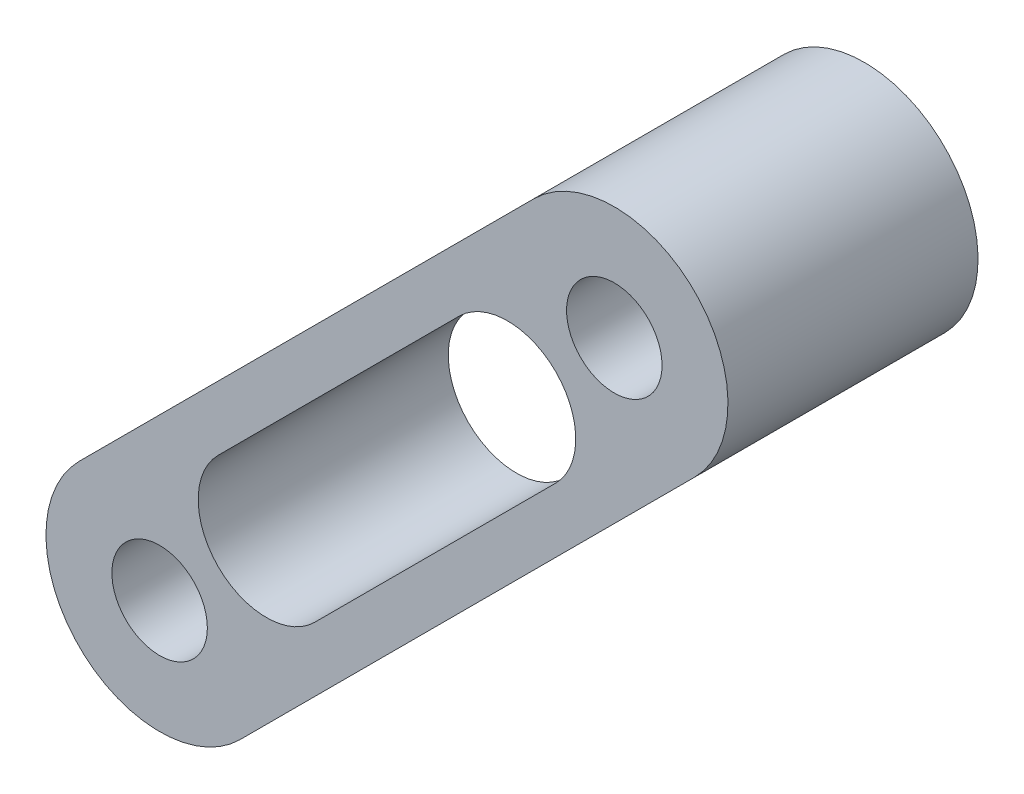
ISO-10303-21;
HEADER;
FILE_DESCRIPTION(('STEP AP214'),'2;1');
FILE_NAME('part.step','',(''),(''),'','','');
FILE_SCHEMA(('AUTOMOTIVE_DESIGN { 1 0 10303 214 1 1 1 1 }'));
ENDSEC;
DATA;
#1=APPLICATION_CONTEXT('core data for automotive mechanical design processes');
#2=APPLICATION_PROTOCOL_DEFINITION('international standard','automotive_design',2000,#1);
#3=PRODUCT_CONTEXT('',#1,'mechanical');
#4=PRODUCT('Part','Part','',(#3));
#5=PRODUCT_RELATED_PRODUCT_CATEGORY('part','',(#4));
#6=PRODUCT_DEFINITION_FORMATION('','',#4);
#7=PRODUCT_DEFINITION_CONTEXT('part definition',#1,'design');
#8=PRODUCT_DEFINITION('design','',#6,#7);
#9=PRODUCT_DEFINITION_SHAPE('','',#8);
#10=(LENGTH_UNIT() NAMED_UNIT(*) SI_UNIT(.MILLI.,.METRE.));
#11=(NAMED_UNIT(*) PLANE_ANGLE_UNIT() SI_UNIT($,.RADIAN.));
#12=(NAMED_UNIT(*) SI_UNIT($,.STERADIAN.) SOLID_ANGLE_UNIT());
#13=UNCERTAINTY_MEASURE_WITH_UNIT(LENGTH_MEASURE(1.E-05),#10,'distance_accuracy_value','');
#14=(GEOMETRIC_REPRESENTATION_CONTEXT(3) GLOBAL_UNCERTAINTY_ASSIGNED_CONTEXT((#13)) GLOBAL_UNIT_ASSIGNED_CONTEXT((#10,
#11,#12)) REPRESENTATION_CONTEXT('',''));
#15=CARTESIAN_POINT('',(0.,0.,0.));
#16=DIRECTION('',(0.,0.,1.));
#17=DIRECTION('',(1.,0.,0.));
#18=AXIS2_PLACEMENT_3D('',#15,#16,#17);
#19=CARTESIAN_POINT('',(-20.,0.,11.));
#20=DIRECTION('',(0.,0.,1.));
#21=DIRECTION('',(1.,0.,0.));
#22=AXIS2_PLACEMENT_3D('',#19,#20,#21);
#23=PLANE('',#22);
#24=CARTESIAN_POINT('',(-20.,0.,11.));
#25=DIRECTION('',(0.,0.,1.));
#26=DIRECTION('',(1.,0.,0.));
#27=AXIS2_PLACEMENT_3D('',#24,#25,#26);
#28=CIRCLE('',#27,2.1);
#29=CARTESIAN_POINT('',(-17.9,0.,11.));
#30=VERTEX_POINT('',#29);
#31=EDGE_CURVE('E140',#30,#30,#28,.T.);
#32=ORIENTED_EDGE('',*,*,#31,.F.);
#33=EDGE_LOOP('',(#32));
#34=FACE_BOUND('',#33,.T.);
#35=CARTESIAN_POINT('',(-20.,0.,11.));
#36=DIRECTION('',(0.,0.,1.));
#37=DIRECTION('',(1.,0.,0.));
#38=AXIS2_PLACEMENT_3D('',#35,#36,#37);
#39=CIRCLE('',#38,5.);
#40=CARTESIAN_POINT('',(-23.5355339059327,3.53553390593273,11.));
#41=VERTEX_POINT('',#40);
#42=CARTESIAN_POINT('',(-16.4644660940673,-3.53553390593274,11.));
#43=VERTEX_POINT('',#42);
#44=EDGE_CURVE('E146',#41,#43,#39,.T.);
#45=ORIENTED_EDGE('',*,*,#44,.T.);
#46=DIRECTION('',(0.707106781186547,0.707106781186548,0.));
#47=VECTOR('',#46,1.);
#48=CARTESIAN_POINT('',(-16.4644660940673,-3.53553390593274,11.));
#49=LINE('',#48,#47);
#50=CARTESIAN_POINT('',(3.53553390593273,16.4644660940673,11.));
#51=VERTEX_POINT('',#50);
#52=EDGE_CURVE('E149',#43,#51,#49,.T.);
#53=ORIENTED_EDGE('',*,*,#52,.T.);
#54=CARTESIAN_POINT('',(0.,20.,11.));
#55=DIRECTION('',(0.,0.,1.));
#56=DIRECTION('',(1.,0.,0.));
#57=AXIS2_PLACEMENT_3D('',#54,#55,#56);
#58=CIRCLE('',#57,4.99999999999999);
#59=CARTESIAN_POINT('',(-3.53553390593274,23.5355339059327,11.));
#60=VERTEX_POINT('',#59);
#61=EDGE_CURVE('E152',#51,#60,#58,.T.);
#62=ORIENTED_EDGE('',*,*,#61,.T.);
#63=DIRECTION('',(-0.707106781186547,-0.707106781186548,0.));
#64=VECTOR('',#63,1.);
#65=CARTESIAN_POINT('',(-23.5355339059327,3.53553390593273,11.));
#66=LINE('',#65,#64);
#67=EDGE_CURVE('E154',#60,#41,#66,.T.);
#68=ORIENTED_EDGE('',*,*,#67,.T.);
#69=EDGE_LOOP('',(#45,#53,#62,#68));
#70=FACE_BOUND('',#69,.T.);
#71=CARTESIAN_POINT('',(0.,20.,11.));
#72=DIRECTION('',(0.,0.,1.));
#73=DIRECTION('',(1.,0.,0.));
#74=AXIS2_PLACEMENT_3D('',#71,#72,#73);
#75=CIRCLE('',#74,2.1);
#76=CARTESIAN_POINT('',(2.1,20.,11.));
#77=VERTEX_POINT('',#76);
#78=EDGE_CURVE('E134',#77,#77,#75,.T.);
#79=ORIENTED_EDGE('',*,*,#78,.F.);
#80=EDGE_LOOP('',(#79));
#81=FACE_BOUND('',#80,.T.);
#82=DIRECTION('',(0.707106781186547,0.707106781186548,0.));
#83=VECTOR('',#82,1.);
#84=CARTESIAN_POINT('',(-13.1819805153395,2.57537879754125,11.));
#85=LINE('',#84,#83);
#86=CARTESIAN_POINT('',(-13.1819805153395,2.57537879754125,11.));
#87=VERTEX_POINT('',#86);
#88=CARTESIAN_POINT('',(-2.57537879754126,13.1819805153395,11.));
#89=VERTEX_POINT('',#88);
#90=EDGE_CURVE('E106',#87,#89,#85,.T.);
#91=ORIENTED_EDGE('',*,*,#90,.F.);
#92=CARTESIAN_POINT('',(-15.3033008588991,4.69669914110089,11.));
#93=DIRECTION('',(0.,0.,1.));
#94=DIRECTION('',(1.,0.,0.));
#95=AXIS2_PLACEMENT_3D('',#92,#93,#94);
#96=CIRCLE('',#95,3.);
#97=CARTESIAN_POINT('',(-17.4246212024587,6.81801948466053,11.));
#98=VERTEX_POINT('',#97);
#99=EDGE_CURVE('E98',#98,#87,#96,.T.);
#100=ORIENTED_EDGE('',*,*,#99,.F.);
#101=DIRECTION('',(-0.707106781186547,-0.707106781186548,0.));
#102=VECTOR('',#101,1.);
#103=CARTESIAN_POINT('',(-17.4246212024587,6.81801948466053,11.));
#104=LINE('',#103,#102);
#105=CARTESIAN_POINT('',(-6.81801948466054,17.4246212024587,11.));
#106=VERTEX_POINT('',#105);
#107=EDGE_CURVE('E120',#106,#98,#104,.T.);
#108=ORIENTED_EDGE('',*,*,#107,.F.);
#109=CARTESIAN_POINT('',(-4.6966991411009,15.3033008588991,11.));
#110=DIRECTION('',(0.,0.,1.));
#111=DIRECTION('',(1.,0.,0.));
#112=AXIS2_PLACEMENT_3D('',#109,#110,#111);
#113=CIRCLE('',#112,3.);
#114=EDGE_CURVE('E118',#89,#106,#113,.T.);
#115=ORIENTED_EDGE('',*,*,#114,.F.);
#116=EDGE_LOOP('',(#91,#100,#108,#115));
#117=FACE_BOUND('',#116,.T.);
#118=ADVANCED_FACE('F33',(#34,#70,#81,#117),#23,.T.);
#119=CARTESIAN_POINT('',(-20.,0.,0.));
#120=DIRECTION('',(0.,0.,1.));
#121=DIRECTION('',(1.,0.,0.));
#122=AXIS2_PLACEMENT_3D('',#119,#120,#121);
#123=PLANE('',#122);
#124=CARTESIAN_POINT('',(0.,20.,0.));
#125=DIRECTION('',(0.,0.,1.));
#126=DIRECTION('',(1.,0.,0.));
#127=AXIS2_PLACEMENT_3D('',#124,#125,#126);
#128=CIRCLE('',#127,2.1);
#129=CARTESIAN_POINT('',(2.1,20.,0.));
#130=VERTEX_POINT('',#129);
#131=EDGE_CURVE('E114',#130,#130,#128,.T.);
#132=ORIENTED_EDGE('',*,*,#131,.T.);
#133=EDGE_LOOP('',(#132));
#134=FACE_BOUND('',#133,.T.);
#135=CARTESIAN_POINT('',(-20.,0.,0.));
#136=DIRECTION('',(0.,0.,1.));
#137=DIRECTION('',(1.,0.,0.));
#138=AXIS2_PLACEMENT_3D('',#135,#136,#137);
#139=CIRCLE('',#138,2.1);
#140=CARTESIAN_POINT('',(-17.9,0.,0.));
#141=VERTEX_POINT('',#140);
#142=EDGE_CURVE('E137',#141,#141,#139,.T.);
#143=ORIENTED_EDGE('',*,*,#142,.T.);
#144=EDGE_LOOP('',(#143));
#145=FACE_BOUND('',#144,.T.);
#146=CARTESIAN_POINT('',(-20.,0.,0.));
#147=DIRECTION('',(0.,0.,1.));
#148=DIRECTION('',(1.,0.,0.));
#149=AXIS2_PLACEMENT_3D('',#146,#147,#148);
#150=CIRCLE('',#149,5.);
#151=CARTESIAN_POINT('',(-23.5355339059327,3.53553390593273,0.));
#152=VERTEX_POINT('',#151);
#153=CARTESIAN_POINT('',(-16.4644660940673,-3.53553390593274,0.));
#154=VERTEX_POINT('',#153);
#155=EDGE_CURVE('E143',#152,#154,#150,.T.);
#156=ORIENTED_EDGE('',*,*,#155,.F.);
#157=DIRECTION('',(-0.707106781186547,-0.707106781186548,0.));
#158=VECTOR('',#157,1.);
#159=CARTESIAN_POINT('',(-23.5355339059327,3.53553390593273,0.));
#160=LINE('',#159,#158);
#161=CARTESIAN_POINT('',(-3.53553390593274,23.5355339059327,0.));
#162=VERTEX_POINT('',#161);
#163=EDGE_CURVE('E150',#162,#152,#160,.T.);
#164=ORIENTED_EDGE('',*,*,#163,.F.);
#165=CARTESIAN_POINT('',(0.,20.,0.));
#166=DIRECTION('',(0.,0.,1.));
#167=DIRECTION('',(1.,0.,0.));
#168=AXIS2_PLACEMENT_3D('',#165,#166,#167);
#169=CIRCLE('',#168,4.99999999999999);
#170=CARTESIAN_POINT('',(3.53553390593273,16.4644660940673,0.));
#171=VERTEX_POINT('',#170);
#172=EDGE_CURVE('E161',#171,#162,#169,.T.);
#173=ORIENTED_EDGE('',*,*,#172,.F.);
#174=DIRECTION('',(0.707106781186547,0.707106781186548,0.));
#175=VECTOR('',#174,1.);
#176=CARTESIAN_POINT('',(-16.4644660940673,-3.53553390593274,0.));
#177=LINE('',#176,#175);
#178=EDGE_CURVE('E159',#154,#171,#177,.T.);
#179=ORIENTED_EDGE('',*,*,#178,.F.);
#180=EDGE_LOOP('',(#156,#164,#173,#179));
#181=FACE_BOUND('',#180,.T.);
#182=CARTESIAN_POINT('',(-15.3033008588991,4.69669914110089,0.));
#183=DIRECTION('',(0.,0.,1.));
#184=DIRECTION('',(1.,0.,0.));
#185=AXIS2_PLACEMENT_3D('',#182,#183,#184);
#186=CIRCLE('',#185,3.);
#187=CARTESIAN_POINT('',(-17.4246212024587,6.81801948466053,0.));
#188=VERTEX_POINT('',#187);
#189=CARTESIAN_POINT('',(-13.1819805153395,2.57537879754125,0.));
#190=VERTEX_POINT('',#189);
#191=EDGE_CURVE('E56',#188,#190,#186,.T.);
#192=ORIENTED_EDGE('',*,*,#191,.T.);
#193=DIRECTION('',(0.707106781186547,0.707106781186548,0.));
#194=VECTOR('',#193,1.);
#195=CARTESIAN_POINT('',(-13.1819805153395,2.57537879754125,0.));
#196=LINE('',#195,#194);
#197=CARTESIAN_POINT('',(-2.57537879754126,13.1819805153395,0.));
#198=VERTEX_POINT('',#197);
#199=EDGE_CURVE('E113',#190,#198,#196,.T.);
#200=ORIENTED_EDGE('',*,*,#199,.T.);
#201=CARTESIAN_POINT('',(-4.6966991411009,15.3033008588991,0.));
#202=DIRECTION('',(0.,0.,1.));
#203=DIRECTION('',(1.,0.,0.));
#204=AXIS2_PLACEMENT_3D('',#201,#202,#203);
#205=CIRCLE('',#204,3.);
#206=CARTESIAN_POINT('',(-6.81801948466054,17.4246212024587,0.));
#207=VERTEX_POINT('',#206);
#208=EDGE_CURVE('E126',#198,#207,#205,.T.);
#209=ORIENTED_EDGE('',*,*,#208,.T.);
#210=DIRECTION('',(-0.707106781186547,-0.707106781186548,0.));
#211=VECTOR('',#210,1.);
#212=CARTESIAN_POINT('',(-17.4246212024587,6.81801948466053,0.));
#213=LINE('',#212,#211);
#214=EDGE_CURVE('E107',#207,#188,#213,.T.);
#215=ORIENTED_EDGE('',*,*,#214,.T.);
#216=EDGE_LOOP('',(#192,#200,#209,#215));
#217=FACE_BOUND('',#216,.T.);
#218=ADVANCED_FACE('F179',(#134,#145,#181,#217),#123,.F.);
#219=CARTESIAN_POINT('',(-20.,0.,11.));
#220=DIRECTION('',(0.,0.,-1.));
#221=DIRECTION('',(-1.,0.,0.));
#222=AXIS2_PLACEMENT_3D('',#219,#220,#221);
#223=CYLINDRICAL_SURFACE('',#222,5.);
#224=ORIENTED_EDGE('',*,*,#155,.T.);
#225=DIRECTION('',(0.,0.,-1.));
#226=VECTOR('',#225,1.);
#227=CARTESIAN_POINT('',(-16.4644660940673,-3.53553390593274,11.));
#228=LINE('',#227,#226);
#229=EDGE_CURVE('E11',#43,#154,#228,.T.);
#230=ORIENTED_EDGE('',*,*,#229,.F.);
#231=ORIENTED_EDGE('',*,*,#44,.F.);
#232=DIRECTION('',(0.,0.,-1.));
#233=VECTOR('',#232,1.);
#234=CARTESIAN_POINT('',(-23.5355339059327,3.53553390593273,11.));
#235=LINE('',#234,#233);
#236=EDGE_CURVE('E156',#41,#152,#235,.T.);
#237=ORIENTED_EDGE('',*,*,#236,.T.);
#238=EDGE_LOOP('',(#224,#230,#231,#237));
#239=FACE_BOUND('',#238,.T.);
#240=ADVANCED_FACE('F35',(#239),#223,.T.);
#241=CARTESIAN_POINT('',(-16.4644660940673,-3.53553390593274,11.));
#242=DIRECTION('',(-0.707106781186548,0.707106781186547,0.));
#243=DIRECTION('',(-0.707106781186547,-0.707106781186548,0.));
#244=AXIS2_PLACEMENT_3D('',#241,#242,#243);
#245=PLANE('',#244);
#246=ORIENTED_EDGE('',*,*,#178,.T.);
#247=DIRECTION('',(0.,0.,-1.));
#248=VECTOR('',#247,1.);
#249=CARTESIAN_POINT('',(3.53553390593273,16.4644660940673,11.));
#250=LINE('',#249,#248);
#251=EDGE_CURVE('E41',#51,#171,#250,.T.);
#252=ORIENTED_EDGE('',*,*,#251,.F.);
#253=ORIENTED_EDGE('',*,*,#52,.F.);
#254=ORIENTED_EDGE('',*,*,#229,.T.);
#255=EDGE_LOOP('',(#246,#252,#253,#254));
#256=FACE_BOUND('',#255,.T.);
#257=ADVANCED_FACE('F190',(#256),#245,.F.);
#258=CARTESIAN_POINT('',(0.,20.,11.));
#259=DIRECTION('',(0.,0.,-1.));
#260=DIRECTION('',(-1.,0.,0.));
#261=AXIS2_PLACEMENT_3D('',#258,#259,#260);
#262=CYLINDRICAL_SURFACE('',#261,4.99999999999999);
#263=ORIENTED_EDGE('',*,*,#172,.T.);
#264=DIRECTION('',(0.,0.,-1.));
#265=VECTOR('',#264,1.);
#266=CARTESIAN_POINT('',(-3.53553390593274,23.5355339059327,11.));
#267=LINE('',#266,#265);
#268=EDGE_CURVE('E166',#60,#162,#267,.T.);
#269=ORIENTED_EDGE('',*,*,#268,.F.);
#270=ORIENTED_EDGE('',*,*,#61,.F.);
#271=ORIENTED_EDGE('',*,*,#251,.T.);
#272=EDGE_LOOP('',(#263,#269,#270,#271));
#273=FACE_BOUND('',#272,.T.);
#274=ADVANCED_FACE('F173',(#273),#262,.T.);
#275=CARTESIAN_POINT('',(-23.5355339059327,3.53553390593273,11.));
#276=DIRECTION('',(0.707106781186548,-0.707106781186547,0.));
#277=DIRECTION('',(0.707106781186547,0.707106781186548,0.));
#278=AXIS2_PLACEMENT_3D('',#275,#276,#277);
#279=PLANE('',#278);
#280=ORIENTED_EDGE('',*,*,#163,.T.);
#281=ORIENTED_EDGE('',*,*,#236,.F.);
#282=ORIENTED_EDGE('',*,*,#67,.F.);
#283=ORIENTED_EDGE('',*,*,#268,.T.);
#284=EDGE_LOOP('',(#280,#281,#282,#283));
#285=FACE_BOUND('',#284,.T.);
#286=ADVANCED_FACE('F183',(#285),#279,.F.);
#287=CARTESIAN_POINT('',(-20.,0.,11.));
#288=DIRECTION('',(0.,0.,-1.));
#289=DIRECTION('',(-1.,0.,0.));
#290=AXIS2_PLACEMENT_3D('',#287,#288,#289);
#291=CYLINDRICAL_SURFACE('',#290,2.1);
#292=ORIENTED_EDGE('',*,*,#31,.T.);
#293=EDGE_LOOP('',(#292));
#294=FACE_BOUND('',#293,.T.);
#295=ORIENTED_EDGE('',*,*,#142,.F.);
#296=EDGE_LOOP('',(#295));
#297=FACE_BOUND('',#296,.T.);
#298=ADVANCED_FACE('F207',(#294,#297),#291,.F.);
#299=CARTESIAN_POINT('',(0.,20.,11.));
#300=DIRECTION('',(0.,0.,-1.));
#301=DIRECTION('',(-1.,0.,0.));
#302=AXIS2_PLACEMENT_3D('',#299,#300,#301);
#303=CYLINDRICAL_SURFACE('',#302,2.1);
#304=ORIENTED_EDGE('',*,*,#78,.T.);
#305=EDGE_LOOP('',(#304));
#306=FACE_BOUND('',#305,.T.);
#307=ORIENTED_EDGE('',*,*,#131,.F.);
#308=EDGE_LOOP('',(#307));
#309=FACE_BOUND('',#308,.T.);
#310=ADVANCED_FACE('F214',(#306,#309),#303,.F.);
#311=CARTESIAN_POINT('',(-15.3033008588991,4.69669914110089,11.));
#312=DIRECTION('',(0.,0.,-1.));
#313=DIRECTION('',(-1.,0.,0.));
#314=AXIS2_PLACEMENT_3D('',#311,#312,#313);
#315=CYLINDRICAL_SURFACE('',#314,3.);
#316=ORIENTED_EDGE('',*,*,#191,.F.);
#317=DIRECTION('',(0.,0.,-1.));
#318=VECTOR('',#317,1.);
#319=CARTESIAN_POINT('',(-17.4246212024587,6.81801948466053,11.));
#320=LINE('',#319,#318);
#321=EDGE_CURVE('E102',#98,#188,#320,.T.);
#322=ORIENTED_EDGE('',*,*,#321,.F.);
#323=ORIENTED_EDGE('',*,*,#99,.T.);
#324=DIRECTION('',(0.,0.,-1.));
#325=VECTOR('',#324,1.);
#326=CARTESIAN_POINT('',(-13.1819805153395,2.57537879754125,11.));
#327=LINE('',#326,#325);
#328=EDGE_CURVE('E101',#87,#190,#327,.T.);
#329=ORIENTED_EDGE('',*,*,#328,.T.);
#330=EDGE_LOOP('',(#316,#322,#323,#329));
#331=FACE_BOUND('',#330,.T.);
#332=ADVANCED_FACE('F100',(#331),#315,.F.);
#333=CARTESIAN_POINT('',(-13.1819805153395,2.57537879754125,11.));
#334=DIRECTION('',(-0.707106781186548,0.707106781186547,0.));
#335=DIRECTION('',(-0.707106781186547,-0.707106781186548,0.));
#336=AXIS2_PLACEMENT_3D('',#333,#334,#335);
#337=PLANE('',#336);
#338=ORIENTED_EDGE('',*,*,#199,.F.);
#339=ORIENTED_EDGE('',*,*,#328,.F.);
#340=ORIENTED_EDGE('',*,*,#90,.T.);
#341=DIRECTION('',(0.,0.,-1.));
#342=VECTOR('',#341,1.);
#343=CARTESIAN_POINT('',(-2.57537879754126,13.1819805153395,11.));
#344=LINE('',#343,#342);
#345=EDGE_CURVE('E115',#89,#198,#344,.T.);
#346=ORIENTED_EDGE('',*,*,#345,.T.);
#347=EDGE_LOOP('',(#338,#339,#340,#346));
#348=FACE_BOUND('',#347,.T.);
#349=ADVANCED_FACE('F110',(#348),#337,.T.);
#350=CARTESIAN_POINT('',(-4.6966991411009,15.3033008588991,11.));
#351=DIRECTION('',(0.,0.,-1.));
#352=DIRECTION('',(-1.,0.,0.));
#353=AXIS2_PLACEMENT_3D('',#350,#351,#352);
#354=CYLINDRICAL_SURFACE('',#353,3.);
#355=ORIENTED_EDGE('',*,*,#208,.F.);
#356=ORIENTED_EDGE('',*,*,#345,.F.);
#357=ORIENTED_EDGE('',*,*,#114,.T.);
#358=DIRECTION('',(0.,0.,-1.));
#359=VECTOR('',#358,1.);
#360=CARTESIAN_POINT('',(-6.81801948466054,17.4246212024587,11.));
#361=LINE('',#360,#359);
#362=EDGE_CURVE('E48',#106,#207,#361,.T.);
#363=ORIENTED_EDGE('',*,*,#362,.T.);
#364=EDGE_LOOP('',(#355,#356,#357,#363));
#365=FACE_BOUND('',#364,.T.);
#366=ADVANCED_FACE('F231',(#365),#354,.F.);
#367=CARTESIAN_POINT('',(-17.4246212024587,6.81801948466053,11.));
#368=DIRECTION('',(0.707106781186548,-0.707106781186547,0.));
#369=DIRECTION('',(0.707106781186547,0.707106781186548,0.));
#370=AXIS2_PLACEMENT_3D('',#367,#368,#369);
#371=PLANE('',#370);
#372=ORIENTED_EDGE('',*,*,#214,.F.);
#373=ORIENTED_EDGE('',*,*,#362,.F.);
#374=ORIENTED_EDGE('',*,*,#107,.T.);
#375=ORIENTED_EDGE('',*,*,#321,.T.);
#376=EDGE_LOOP('',(#372,#373,#374,#375));
#377=FACE_BOUND('',#376,.T.);
#378=ADVANCED_FACE('F234',(#377),#371,.T.);
#379=CLOSED_SHELL('',(#118,#218,#240,#257,#274,#286,#298,#310,#332,#349,#366,#378));
#380=MANIFOLD_SOLID_BREP('B2',#379);
#381=ADVANCED_BREP_SHAPE_REPRESENTATION('',(#18,#380),#14);
#382=SHAPE_DEFINITION_REPRESENTATION(#9,#381);
ENDSEC;
END-ISO-10303-21;
